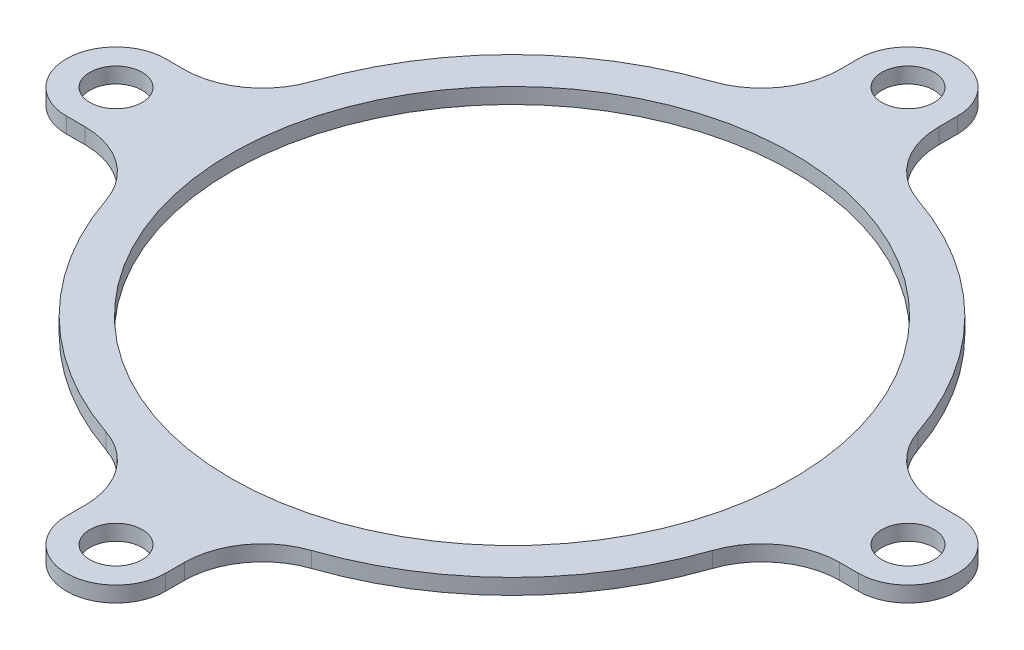
ISO-10303-21;
HEADER;
FILE_DESCRIPTION(('STEP AP214'),'2;1');
FILE_NAME('part.step','',(''),(''),'','','');
FILE_SCHEMA(('AUTOMOTIVE_DESIGN { 1 0 10303 214 1 1 1 1 }'));
ENDSEC;
DATA;
#1=APPLICATION_CONTEXT('core data for automotive mechanical design processes');
#2=APPLICATION_PROTOCOL_DEFINITION('international standard','automotive_design',2000,#1);
#3=PRODUCT_CONTEXT('',#1,'mechanical');
#4=PRODUCT('Part','Part','',(#3));
#5=PRODUCT_RELATED_PRODUCT_CATEGORY('part','',(#4));
#6=PRODUCT_DEFINITION_FORMATION('','',#4);
#7=PRODUCT_DEFINITION_CONTEXT('part definition',#1,'design');
#8=PRODUCT_DEFINITION('design','',#6,#7);
#9=PRODUCT_DEFINITION_SHAPE('','',#8);
#10=(LENGTH_UNIT() NAMED_UNIT(*) SI_UNIT(.MILLI.,.METRE.));
#11=(NAMED_UNIT(*) PLANE_ANGLE_UNIT() SI_UNIT($,.RADIAN.));
#12=(NAMED_UNIT(*) SI_UNIT($,.STERADIAN.) SOLID_ANGLE_UNIT());
#13=UNCERTAINTY_MEASURE_WITH_UNIT(LENGTH_MEASURE(1.E-05),#10,'distance_accuracy_value','');
#14=(GEOMETRIC_REPRESENTATION_CONTEXT(3) GLOBAL_UNCERTAINTY_ASSIGNED_CONTEXT((#13)) GLOBAL_UNIT_ASSIGNED_CONTEXT((#10,
#11,#12)) REPRESENTATION_CONTEXT('',''));
#15=CARTESIAN_POINT('',(0.,0.,0.));
#16=DIRECTION('',(0.,0.,1.));
#17=DIRECTION('',(1.,0.,0.));
#18=AXIS2_PLACEMENT_3D('',#15,#16,#17);
#19=CARTESIAN_POINT('',(0.,1.,0.));
#20=DIRECTION('',(0.,-1.,0.));
#21=DIRECTION('',(0.,0.,-1.));
#22=AXIS2_PLACEMENT_3D('',#19,#20,#21);
#23=CYLINDRICAL_SURFACE('',#22,41.);
#24=DIRECTION('',(0.,1.,0.));
#25=VECTOR('',#24,1.);
#26=CARTESIAN_POINT('',(38.8359649201647,-32.9815945313607,-13.1441176470592));
#27=LINE('',#26,#25);
#28=CARTESIAN_POINT('',(38.8359649201647,-1.,-13.1441176470592));
#29=VERTEX_POINT('',#28);
#30=CARTESIAN_POINT('',(38.8359649201647,1.,-13.1441176470592));
#31=VERTEX_POINT('',#30);
#32=EDGE_CURVE('E236',#29,#31,#27,.T.);
#33=ORIENTED_EDGE('',*,*,#32,.F.);
#34=CARTESIAN_POINT('',(0.,-1.,0.));
#35=DIRECTION('',(0.,1.,0.));
#36=DIRECTION('',(0.,0.,1.));
#37=AXIS2_PLACEMENT_3D('',#34,#35,#36);
#38=CIRCLE('',#37,41.);
#39=CARTESIAN_POINT('',(13.1441176470588,-1.,-38.8359649201649));
#40=VERTEX_POINT('',#39);
#41=EDGE_CURVE('E386',#29,#40,#38,.T.);
#42=ORIENTED_EDGE('',*,*,#41,.T.);
#43=DIRECTION('',(0.,1.,0.));
#44=VECTOR('',#43,1.);
#45=CARTESIAN_POINT('',(13.1441176470588,-32.9815945313606,-38.8359649201649));
#46=LINE('',#45,#44);
#47=CARTESIAN_POINT('',(13.1441176470588,1.,-38.8359649201649));
#48=VERTEX_POINT('',#47);
#49=EDGE_CURVE('E376',#40,#48,#46,.T.);
#50=ORIENTED_EDGE('',*,*,#49,.T.);
#51=CARTESIAN_POINT('',(0.,1.,0.));
#52=DIRECTION('',(0.,1.,0.));
#53=DIRECTION('',(0.,0.,1.));
#54=AXIS2_PLACEMENT_3D('',#51,#52,#53);
#55=CIRCLE('',#54,41.);
#56=EDGE_CURVE('E47',#31,#48,#55,.T.);
#57=ORIENTED_EDGE('',*,*,#56,.F.);
#58=EDGE_LOOP('',(#33,#42,#50,#57));
#59=FACE_BOUND('',#58,.T.);
#60=ADVANCED_FACE('F37',(#59),#23,.T.);
#61=CARTESIAN_POINT('',(13.1441176470588,-1.,38.8359649201649));
#62=VERTEX_POINT('',#61);
#63=CARTESIAN_POINT('',(38.835964920165,-1.,13.1441176470584));
#64=VERTEX_POINT('',#63);
#65=EDGE_CURVE('E444',#62,#64,#38,.T.);
#66=ORIENTED_EDGE('',*,*,#65,.T.);
#67=DIRECTION('',(0.,1.,0.));
#68=VECTOR('',#67,1.);
#69=CARTESIAN_POINT('',(38.835964920165,-32.9815945313607,13.1441176470584));
#70=LINE('',#69,#68);
#71=CARTESIAN_POINT('',(38.835964920165,1.,13.1441176470584));
#72=VERTEX_POINT('',#71);
#73=EDGE_CURVE('E61',#64,#72,#70,.T.);
#74=ORIENTED_EDGE('',*,*,#73,.T.);
#75=CARTESIAN_POINT('',(13.1441176470588,1.,38.8359649201649));
#76=VERTEX_POINT('',#75);
#77=EDGE_CURVE('E224',#76,#72,#55,.T.);
#78=ORIENTED_EDGE('',*,*,#77,.F.);
#79=DIRECTION('',(0.,1.,0.));
#80=VECTOR('',#79,1.);
#81=CARTESIAN_POINT('',(13.1441176470588,-32.9815945313606,38.8359649201649));
#82=LINE('',#81,#80);
#83=EDGE_CURVE('E278',#62,#76,#82,.T.);
#84=ORIENTED_EDGE('',*,*,#83,.F.);
#85=EDGE_LOOP('',(#66,#74,#78,#84));
#86=FACE_BOUND('',#85,.T.);
#87=ADVANCED_FACE('F410',(#86),#23,.T.);
#88=CARTESIAN_POINT('',(-38.8359649201648,-1.,13.1441176470589));
#89=VERTEX_POINT('',#88);
#90=CARTESIAN_POINT('',(-13.1441176470588,-1.,38.8359649201649));
#91=VERTEX_POINT('',#90);
#92=EDGE_CURVE('E440',#89,#91,#38,.T.);
#93=ORIENTED_EDGE('',*,*,#92,.T.);
#94=DIRECTION('',(0.,1.,0.));
#95=VECTOR('',#94,1.);
#96=CARTESIAN_POINT('',(-13.1441176470588,-32.9815945313606,38.8359649201649));
#97=LINE('',#96,#95);
#98=CARTESIAN_POINT('',(-13.1441176470588,1.,38.8359649201649));
#99=VERTEX_POINT('',#98);
#100=EDGE_CURVE('E286',#91,#99,#97,.T.);
#101=ORIENTED_EDGE('',*,*,#100,.T.);
#102=CARTESIAN_POINT('',(-38.8359649201648,1.,13.144117647059));
#103=VERTEX_POINT('',#102);
#104=EDGE_CURVE('E46',#103,#99,#55,.T.);
#105=ORIENTED_EDGE('',*,*,#104,.F.);
#106=DIRECTION('',(0.,1.,0.));
#107=VECTOR('',#106,1.);
#108=CARTESIAN_POINT('',(-38.8359649201648,-32.9815945313607,13.1441176470589));
#109=LINE('',#108,#107);
#110=EDGE_CURVE('E323',#89,#103,#109,.T.);
#111=ORIENTED_EDGE('',*,*,#110,.F.);
#112=EDGE_LOOP('',(#93,#101,#105,#111));
#113=FACE_BOUND('',#112,.T.);
#114=ADVANCED_FACE('F406',(#113),#23,.T.);
#115=CARTESIAN_POINT('',(0.,1.,0.));
#116=DIRECTION('',(0.,1.,0.));
#117=DIRECTION('',(0.,0.,1.));
#118=AXIS2_PLACEMENT_3D('',#115,#116,#117);
#119=PLANE('',#118);
#120=CARTESIAN_POINT('',(-13.1441176470588,1.,-38.8359649201649));
#121=VERTEX_POINT('',#120);
#122=CARTESIAN_POINT('',(-38.8359649201649,1.,-13.1441176470587));
#123=VERTEX_POINT('',#122);
#124=EDGE_CURVE('E11',#121,#123,#55,.T.);
#125=ORIENTED_EDGE('',*,*,#124,.T.);
#126=CARTESIAN_POINT('',(-48.3081514860588,1.,-16.3499999999998));
#127=DIRECTION('',(0.,-1.,0.));
#128=DIRECTION('',(1.,0.,0.));
#129=AXIS2_PLACEMENT_3D('',#126,#127,#128);
#130=CIRCLE('',#129,10.);
#131=CARTESIAN_POINT('',(-48.3081514860588,1.,-6.34999999999983));
#132=VERTEX_POINT('',#131);
#133=EDGE_CURVE('E311',#123,#132,#130,.T.);
#134=ORIENTED_EDGE('',*,*,#133,.T.);
#135=DIRECTION('',(-1.,0.,0.));
#136=VECTOR('',#135,1.);
#137=CARTESIAN_POINT('',(-50.7,1.,-6.34999999999982));
#138=LINE('',#137,#136);
#139=CARTESIAN_POINT('',(-50.7,1.,-6.34999999999982));
#140=VERTEX_POINT('',#139);
#141=EDGE_CURVE('E314',#132,#140,#138,.T.);
#142=ORIENTED_EDGE('',*,*,#141,.T.);
#143=CARTESIAN_POINT('',(-50.7,1.,1.77018103879347E-13));
#144=DIRECTION('',(0.,1.,0.));
#145=DIRECTION('',(-1.,0.,0.));
#146=AXIS2_PLACEMENT_3D('',#143,#144,#145);
#147=CIRCLE('',#146,6.35);
#148=CARTESIAN_POINT('',(-50.7,1.,6.35000000000018));
#149=VERTEX_POINT('',#148);
#150=EDGE_CURVE('E317',#140,#149,#147,.T.);
#151=ORIENTED_EDGE('',*,*,#150,.T.);
#152=DIRECTION('',(1.,0.,0.));
#153=VECTOR('',#152,1.);
#154=CARTESIAN_POINT('',(-48.3081514860587,1.,6.35000000000017));
#155=LINE('',#154,#153);
#156=CARTESIAN_POINT('',(-48.3081514860587,1.,6.35000000000017));
#157=VERTEX_POINT('',#156);
#158=EDGE_CURVE('E320',#149,#157,#155,.T.);
#159=ORIENTED_EDGE('',*,*,#158,.T.);
#160=CARTESIAN_POINT('',(-48.3081514860587,1.,16.3500000000002));
#161=DIRECTION('',(0.,-1.,0.));
#162=DIRECTION('',(-1.,0.,0.));
#163=AXIS2_PLACEMENT_3D('',#160,#161,#162);
#164=CIRCLE('',#163,10.);
#165=EDGE_CURVE('E308',#157,#103,#164,.T.);
#166=ORIENTED_EDGE('',*,*,#165,.T.);
#167=ORIENTED_EDGE('',*,*,#104,.T.);
#168=CARTESIAN_POINT('',(-16.35,1.,48.3081514860587));
#169=DIRECTION('',(0.,-1.,0.));
#170=DIRECTION('',(0.,0.,-1.));
#171=AXIS2_PLACEMENT_3D('',#168,#169,#170);
#172=CIRCLE('',#171,10.);
#173=CARTESIAN_POINT('',(-6.35,1.,48.3081514860587));
#174=VERTEX_POINT('',#173);
#175=EDGE_CURVE('E266',#99,#174,#172,.T.);
#176=ORIENTED_EDGE('',*,*,#175,.T.);
#177=DIRECTION('',(0.,0.,1.));
#178=VECTOR('',#177,1.);
#179=CARTESIAN_POINT('',(-6.35,1.,50.7));
#180=LINE('',#179,#178);
#181=CARTESIAN_POINT('',(-6.35,1.,50.7));
#182=VERTEX_POINT('',#181);
#183=EDGE_CURVE('E269',#174,#182,#180,.T.);
#184=ORIENTED_EDGE('',*,*,#183,.T.);
#185=CARTESIAN_POINT('',(0.,1.,50.7));
#186=DIRECTION('',(0.,1.,0.));
#187=DIRECTION('',(0.,0.,1.));
#188=AXIS2_PLACEMENT_3D('',#185,#186,#187);
#189=CIRCLE('',#188,6.35);
#190=CARTESIAN_POINT('',(6.35,1.,50.7));
#191=VERTEX_POINT('',#190);
#192=EDGE_CURVE('E272',#182,#191,#189,.T.);
#193=ORIENTED_EDGE('',*,*,#192,.T.);
#194=DIRECTION('',(0.,0.,-1.));
#195=VECTOR('',#194,1.);
#196=CARTESIAN_POINT('',(6.35,1.,48.3081514860587));
#197=LINE('',#196,#195);
#198=CARTESIAN_POINT('',(6.35,1.,48.3081514860587));
#199=VERTEX_POINT('',#198);
#200=EDGE_CURVE('E275',#191,#199,#197,.T.);
#201=ORIENTED_EDGE('',*,*,#200,.T.);
#202=CARTESIAN_POINT('',(16.35,1.,48.3081514860587));
#203=DIRECTION('',(0.,-1.,0.));
#204=DIRECTION('',(0.,0.,1.));
#205=AXIS2_PLACEMENT_3D('',#202,#203,#204);
#206=CIRCLE('',#205,10.);
#207=EDGE_CURVE('E264',#199,#76,#206,.T.);
#208=ORIENTED_EDGE('',*,*,#207,.T.);
#209=ORIENTED_EDGE('',*,*,#77,.T.);
#210=CARTESIAN_POINT('',(48.3081514860589,1.,16.3499999999995));
#211=DIRECTION('',(0.,-1.,0.));
#212=DIRECTION('',(-1.,0.,0.));
#213=AXIS2_PLACEMENT_3D('',#210,#211,#212);
#214=CIRCLE('',#213,10.);
#215=CARTESIAN_POINT('',(48.3081514860588,1.,6.34999999999949));
#216=VERTEX_POINT('',#215);
#217=EDGE_CURVE('E205',#72,#216,#214,.T.);
#218=ORIENTED_EDGE('',*,*,#217,.T.);
#219=DIRECTION('',(1.,0.,0.));
#220=VECTOR('',#219,1.);
#221=CARTESIAN_POINT('',(50.7000000000001,1.,6.34999999999947));
#222=LINE('',#221,#220);
#223=CARTESIAN_POINT('',(50.7000000000001,1.,6.34999999999947));
#224=VERTEX_POINT('',#223);
#225=EDGE_CURVE('E213',#216,#224,#222,.T.);
#226=ORIENTED_EDGE('',*,*,#225,.T.);
#227=CARTESIAN_POINT('',(50.7,1.,-5.31054311638041E-13));
#228=DIRECTION('',(0.,1.,0.));
#229=DIRECTION('',(1.,0.,0.));
#230=AXIS2_PLACEMENT_3D('',#227,#228,#229);
#231=CIRCLE('',#230,6.35);
#232=CARTESIAN_POINT('',(50.6999999999999,1.,-6.35000000000053));
#233=VERTEX_POINT('',#232);
#234=EDGE_CURVE('E219',#224,#233,#231,.T.);
#235=ORIENTED_EDGE('',*,*,#234,.T.);
#236=DIRECTION('',(-1.,0.,0.));
#237=VECTOR('',#236,1.);
#238=CARTESIAN_POINT('',(48.3081514860587,1.,-6.35000000000051));
#239=LINE('',#238,#237);
#240=CARTESIAN_POINT('',(48.3081514860587,1.,-6.35000000000051));
#241=VERTEX_POINT('',#240);
#242=EDGE_CURVE('E233',#233,#241,#239,.T.);
#243=ORIENTED_EDGE('',*,*,#242,.T.);
#244=CARTESIAN_POINT('',(48.3081514860586,1.,-16.3500000000005));
#245=DIRECTION('',(0.,-1.,0.));
#246=DIRECTION('',(1.,0.,0.));
#247=AXIS2_PLACEMENT_3D('',#244,#245,#246);
#248=CIRCLE('',#247,10.);
#249=EDGE_CURVE('E225',#241,#31,#248,.T.);
#250=ORIENTED_EDGE('',*,*,#249,.T.);
#251=ORIENTED_EDGE('',*,*,#56,.T.);
#252=CARTESIAN_POINT('',(16.35,1.,-48.3081514860587));
#253=DIRECTION('',(0.,-1.,0.));
#254=DIRECTION('',(0.,0.,1.));
#255=AXIS2_PLACEMENT_3D('',#252,#253,#254);
#256=CIRCLE('',#255,10.);
#257=CARTESIAN_POINT('',(6.35,1.,-48.3081514860587));
#258=VERTEX_POINT('',#257);
#259=EDGE_CURVE('E356',#48,#258,#256,.T.);
#260=ORIENTED_EDGE('',*,*,#259,.T.);
#261=DIRECTION('',(0.,0.,-1.));
#262=VECTOR('',#261,1.);
#263=CARTESIAN_POINT('',(6.35,1.,-50.7));
#264=LINE('',#263,#262);
#265=CARTESIAN_POINT('',(6.35,1.,-50.7));
#266=VERTEX_POINT('',#265);
#267=EDGE_CURVE('E359',#258,#266,#264,.T.);
#268=ORIENTED_EDGE('',*,*,#267,.T.);
#269=CARTESIAN_POINT('',(0.,1.,-50.7));
#270=DIRECTION('',(0.,1.,0.));
#271=DIRECTION('',(0.,0.,-1.));
#272=AXIS2_PLACEMENT_3D('',#269,#270,#271);
#273=CIRCLE('',#272,6.35);
#274=CARTESIAN_POINT('',(-6.35,1.,-50.7));
#275=VERTEX_POINT('',#274);
#276=EDGE_CURVE('E362',#266,#275,#273,.T.);
#277=ORIENTED_EDGE('',*,*,#276,.T.);
#278=DIRECTION('',(0.,0.,1.));
#279=VECTOR('',#278,1.);
#280=CARTESIAN_POINT('',(-6.35,1.,-48.3081514860587));
#281=LINE('',#280,#279);
#282=CARTESIAN_POINT('',(-6.35,1.,-48.3081514860587));
#283=VERTEX_POINT('',#282);
#284=EDGE_CURVE('E365',#275,#283,#281,.T.);
#285=ORIENTED_EDGE('',*,*,#284,.T.);
#286=CARTESIAN_POINT('',(-16.35,1.,-48.3081514860587));
#287=DIRECTION('',(0.,-1.,0.));
#288=DIRECTION('',(0.,0.,-1.));
#289=AXIS2_PLACEMENT_3D('',#286,#287,#288);
#290=CIRCLE('',#289,10.);
#291=EDGE_CURVE('E353',#283,#121,#290,.T.);
#292=ORIENTED_EDGE('',*,*,#291,.T.);
#293=EDGE_LOOP('',(#125,#134,#142,#151,#159,#166,#167,#176,#184,#193,#201,#208,#209,#218,#226,
#235,#243,#250,#251,#260,#268,#277,#285,#292));
#294=FACE_BOUND('',#293,.T.);
#295=CARTESIAN_POINT('',(0.,1.,0.));
#296=DIRECTION('',(0.,1.,0.));
#297=DIRECTION('',(0.,0.,1.));
#298=AXIS2_PLACEMENT_3D('',#295,#296,#297);
#299=CIRCLE('',#298,36.);
#300=CARTESIAN_POINT('',(0.,1.,36.));
#301=VERTEX_POINT('',#300);
#302=EDGE_CURVE('E383',#301,#301,#299,.T.);
#303=ORIENTED_EDGE('',*,*,#302,.F.);
#304=EDGE_LOOP('',(#303));
#305=FACE_BOUND('',#304,.T.);
#306=CARTESIAN_POINT('',(0.,1.,-50.7));
#307=DIRECTION('',(0.,1.,0.));
#308=DIRECTION('',(0.,0.,1.));
#309=AXIS2_PLACEMENT_3D('',#306,#307,#308);
#310=CIRCLE('',#309,3.35);
#311=CARTESIAN_POINT('',(0.,1.,-47.35));
#312=VERTEX_POINT('',#311);
#313=EDGE_CURVE('E337',#312,#312,#310,.T.);
#314=ORIENTED_EDGE('',*,*,#313,.F.);
#315=EDGE_LOOP('',(#314));
#316=FACE_BOUND('',#315,.T.);
#317=CARTESIAN_POINT('',(-50.7,1.,1.77018103879347E-13));
#318=DIRECTION('',(0.,1.,0.));
#319=DIRECTION('',(1.,0.,0.));
#320=AXIS2_PLACEMENT_3D('',#317,#318,#319);
#321=CIRCLE('',#320,3.35);
#322=CARTESIAN_POINT('',(-47.35,1.,1.65321641394222E-13));
#323=VERTEX_POINT('',#322);
#324=EDGE_CURVE('E292',#323,#323,#321,.T.);
#325=ORIENTED_EDGE('',*,*,#324,.F.);
#326=EDGE_LOOP('',(#325));
#327=FACE_BOUND('',#326,.T.);
#328=CARTESIAN_POINT('',(0.,1.,50.7));
#329=DIRECTION('',(0.,1.,0.));
#330=DIRECTION('',(0.,0.,-1.));
#331=AXIS2_PLACEMENT_3D('',#328,#329,#330);
#332=CIRCLE('',#331,3.35);
#333=CARTESIAN_POINT('',(0.,1.,47.35));
#334=VERTEX_POINT('',#333);
#335=EDGE_CURVE('E247',#334,#334,#332,.T.);
#336=ORIENTED_EDGE('',*,*,#335,.F.);
#337=EDGE_LOOP('',(#336));
#338=FACE_BOUND('',#337,.T.);
#339=CARTESIAN_POINT('',(50.7,1.,-5.31054311638041E-13));
#340=DIRECTION('',(0.,1.,0.));
#341=DIRECTION('',(-1.,0.,0.));
#342=AXIS2_PLACEMENT_3D('',#339,#340,#341);
#343=CIRCLE('',#342,3.35);
#344=CARTESIAN_POINT('',(47.35,1.,-4.95964924182667E-13));
#345=VERTEX_POINT('',#344);
#346=EDGE_CURVE('E228',#345,#345,#343,.T.);
#347=ORIENTED_EDGE('',*,*,#346,.F.);
#348=EDGE_LOOP('',(#347));
#349=FACE_BOUND('',#348,.T.);
#350=ADVANCED_FACE('F221',(#294,#305,#316,#327,#338,#349),#119,.T.);
#351=CARTESIAN_POINT('',(0.,-1.,0.));
#352=DIRECTION('',(0.,1.,0.));
#353=DIRECTION('',(0.,0.,1.));
#354=AXIS2_PLACEMENT_3D('',#351,#352,#353);
#355=PLANE('',#354);
#356=CARTESIAN_POINT('',(-13.1441176470588,-1.,-38.8359649201649));
#357=VERTEX_POINT('',#356);
#358=CARTESIAN_POINT('',(-38.8359649201649,-1.,-13.1441176470587));
#359=VERTEX_POINT('',#358);
#360=EDGE_CURVE('E41',#357,#359,#38,.T.);
#361=ORIENTED_EDGE('',*,*,#360,.F.);
#362=CARTESIAN_POINT('',(-16.35,-1.,-48.3081514860587));
#363=DIRECTION('',(0.,1.,0.));
#364=DIRECTION('',(0.,0.,1.));
#365=AXIS2_PLACEMENT_3D('',#362,#363,#364);
#366=CIRCLE('',#365,10.);
#367=CARTESIAN_POINT('',(-6.35,-1.,-48.3081514860587));
#368=VERTEX_POINT('',#367);
#369=EDGE_CURVE('E348',#357,#368,#366,.T.);
#370=ORIENTED_EDGE('',*,*,#369,.T.);
#371=DIRECTION('',(0.,0.,-1.));
#372=VECTOR('',#371,1.);
#373=CARTESIAN_POINT('',(-6.35,-1.,-48.3081514860587));
#374=LINE('',#373,#372);
#375=CARTESIAN_POINT('',(-6.35,-1.,-50.7));
#376=VERTEX_POINT('',#375);
#377=EDGE_CURVE('E346',#368,#376,#374,.T.);
#378=ORIENTED_EDGE('',*,*,#377,.T.);
#379=CARTESIAN_POINT('',(0.,-1.,-50.7));
#380=DIRECTION('',(0.,1.,0.));
#381=DIRECTION('',(0.,0.,1.));
#382=AXIS2_PLACEMENT_3D('',#379,#380,#381);
#383=CIRCLE('',#382,6.35);
#384=CARTESIAN_POINT('',(6.35,-1.,-50.7));
#385=VERTEX_POINT('',#384);
#386=EDGE_CURVE('E344',#376,#385,#383,.F.);
#387=ORIENTED_EDGE('',*,*,#386,.T.);
#388=DIRECTION('',(0.,0.,1.));
#389=VECTOR('',#388,1.);
#390=CARTESIAN_POINT('',(6.35,-1.,-50.7));
#391=LINE('',#390,#389);
#392=CARTESIAN_POINT('',(6.35,-1.,-48.3081514860587));
#393=VERTEX_POINT('',#392);
#394=EDGE_CURVE('E341',#385,#393,#391,.T.);
#395=ORIENTED_EDGE('',*,*,#394,.T.);
#396=CARTESIAN_POINT('',(16.35,-1.,-48.3081514860587));
#397=DIRECTION('',(0.,1.,0.));
#398=DIRECTION('',(0.,0.,1.));
#399=AXIS2_PLACEMENT_3D('',#396,#397,#398);
#400=CIRCLE('',#399,10.);
#401=EDGE_CURVE('E338',#393,#40,#400,.T.);
#402=ORIENTED_EDGE('',*,*,#401,.T.);
#403=ORIENTED_EDGE('',*,*,#41,.F.);
#404=CARTESIAN_POINT('',(48.3081514860586,-1.,-16.3500000000005));
#405=DIRECTION('',(0.,1.,0.));
#406=DIRECTION('',(0.,0.,1.));
#407=AXIS2_PLACEMENT_3D('',#404,#405,#406);
#408=CIRCLE('',#407,10.);
#409=CARTESIAN_POINT('',(48.3081514860587,-1.,-6.35000000000051));
#410=VERTEX_POINT('',#409);
#411=EDGE_CURVE('E248',#29,#410,#408,.T.);
#412=ORIENTED_EDGE('',*,*,#411,.T.);
#413=DIRECTION('',(1.,0.,0.));
#414=VECTOR('',#413,1.);
#415=CARTESIAN_POINT('',(48.3081514860587,-1.,-6.35000000000051));
#416=LINE('',#415,#414);
#417=CARTESIAN_POINT('',(50.6999999999999,-1.,-6.35000000000053));
#418=VERTEX_POINT('',#417);
#419=EDGE_CURVE('E421',#410,#418,#416,.T.);
#420=ORIENTED_EDGE('',*,*,#419,.T.);
#421=CARTESIAN_POINT('',(50.7,-1.,-5.31054311638041E-13));
#422=DIRECTION('',(0.,1.,0.));
#423=DIRECTION('',(0.,0.,1.));
#424=AXIS2_PLACEMENT_3D('',#421,#422,#423);
#425=CIRCLE('',#424,6.35);
#426=CARTESIAN_POINT('',(50.7000000000001,-1.,6.34999999999947));
#427=VERTEX_POINT('',#426);
#428=EDGE_CURVE('E423',#418,#427,#425,.F.);
#429=ORIENTED_EDGE('',*,*,#428,.T.);
#430=DIRECTION('',(-1.,0.,0.));
#431=VECTOR('',#430,1.);
#432=CARTESIAN_POINT('',(50.7000000000001,-1.,6.34999999999947));
#433=LINE('',#432,#431);
#434=CARTESIAN_POINT('',(48.3081514860588,-1.,6.3499999999995));
#435=VERTEX_POINT('',#434);
#436=EDGE_CURVE('E456',#427,#435,#433,.T.);
#437=ORIENTED_EDGE('',*,*,#436,.T.);
#438=CARTESIAN_POINT('',(48.3081514860589,-1.,16.3499999999995));
#439=DIRECTION('',(0.,1.,0.));
#440=DIRECTION('',(0.,0.,1.));
#441=AXIS2_PLACEMENT_3D('',#438,#439,#440);
#442=CIRCLE('',#441,10.);
#443=EDGE_CURVE('E207',#435,#64,#442,.T.);
#444=ORIENTED_EDGE('',*,*,#443,.T.);
#445=ORIENTED_EDGE('',*,*,#65,.F.);
#446=CARTESIAN_POINT('',(16.35,-1.,48.3081514860587));
#447=DIRECTION('',(0.,1.,0.));
#448=DIRECTION('',(0.,0.,1.));
#449=AXIS2_PLACEMENT_3D('',#446,#447,#448);
#450=CIRCLE('',#449,10.);
#451=CARTESIAN_POINT('',(6.35,-1.,48.3081514860587));
#452=VERTEX_POINT('',#451);
#453=EDGE_CURVE('E259',#62,#452,#450,.T.);
#454=ORIENTED_EDGE('',*,*,#453,.T.);
#455=DIRECTION('',(0.,0.,1.));
#456=VECTOR('',#455,1.);
#457=CARTESIAN_POINT('',(6.35,-1.,48.3081514860587));
#458=LINE('',#457,#456);
#459=CARTESIAN_POINT('',(6.35,-1.,50.7));
#460=VERTEX_POINT('',#459);
#461=EDGE_CURVE('E257',#452,#460,#458,.T.);
#462=ORIENTED_EDGE('',*,*,#461,.T.);
#463=CARTESIAN_POINT('',(0.,-1.,50.7));
#464=DIRECTION('',(0.,1.,0.));
#465=DIRECTION('',(0.,0.,1.));
#466=AXIS2_PLACEMENT_3D('',#463,#464,#465);
#467=CIRCLE('',#466,6.35);
#468=CARTESIAN_POINT('',(-6.35,-1.,50.7));
#469=VERTEX_POINT('',#468);
#470=EDGE_CURVE('E255',#460,#469,#467,.F.);
#471=ORIENTED_EDGE('',*,*,#470,.T.);
#472=DIRECTION('',(0.,0.,-1.));
#473=VECTOR('',#472,1.);
#474=CARTESIAN_POINT('',(-6.35,-1.,50.7));
#475=LINE('',#474,#473);
#476=CARTESIAN_POINT('',(-6.35,-1.,48.3081514860587));
#477=VERTEX_POINT('',#476);
#478=EDGE_CURVE('E252',#469,#477,#475,.T.);
#479=ORIENTED_EDGE('',*,*,#478,.T.);
#480=CARTESIAN_POINT('',(-16.35,-1.,48.3081514860587));
#481=DIRECTION('',(0.,1.,0.));
#482=DIRECTION('',(0.,0.,1.));
#483=AXIS2_PLACEMENT_3D('',#480,#481,#482);
#484=CIRCLE('',#483,10.);
#485=EDGE_CURVE('E249',#477,#91,#484,.T.);
#486=ORIENTED_EDGE('',*,*,#485,.T.);
#487=ORIENTED_EDGE('',*,*,#92,.F.);
#488=CARTESIAN_POINT('',(-48.3081514860587,-1.,16.3500000000002));
#489=DIRECTION('',(0.,1.,0.));
#490=DIRECTION('',(0.,0.,1.));
#491=AXIS2_PLACEMENT_3D('',#488,#489,#490);
#492=CIRCLE('',#491,10.);
#493=CARTESIAN_POINT('',(-48.3081514860587,-1.,6.35000000000017));
#494=VERTEX_POINT('',#493);
#495=EDGE_CURVE('E303',#89,#494,#492,.T.);
#496=ORIENTED_EDGE('',*,*,#495,.T.);
#497=DIRECTION('',(-1.,0.,0.));
#498=VECTOR('',#497,1.);
#499=CARTESIAN_POINT('',(-48.3081514860587,-1.,6.35000000000017));
#500=LINE('',#499,#498);
#501=CARTESIAN_POINT('',(-50.7,-1.,6.35000000000018));
#502=VERTEX_POINT('',#501);
#503=EDGE_CURVE('E301',#494,#502,#500,.T.);
#504=ORIENTED_EDGE('',*,*,#503,.T.);
#505=CARTESIAN_POINT('',(-50.7,-1.,1.77018103879347E-13));
#506=DIRECTION('',(0.,1.,0.));
#507=DIRECTION('',(0.,0.,1.));
#508=AXIS2_PLACEMENT_3D('',#505,#506,#507);
#509=CIRCLE('',#508,6.35);
#510=CARTESIAN_POINT('',(-50.7,-1.,-6.34999999999982));
#511=VERTEX_POINT('',#510);
#512=EDGE_CURVE('E299',#502,#511,#509,.F.);
#513=ORIENTED_EDGE('',*,*,#512,.T.);
#514=DIRECTION('',(1.,0.,0.));
#515=VECTOR('',#514,1.);
#516=CARTESIAN_POINT('',(-50.7,-1.,-6.34999999999982));
#517=LINE('',#516,#515);
#518=CARTESIAN_POINT('',(-48.3081514860588,-1.,-6.34999999999983));
#519=VERTEX_POINT('',#518);
#520=EDGE_CURVE('E296',#511,#519,#517,.T.);
#521=ORIENTED_EDGE('',*,*,#520,.T.);
#522=CARTESIAN_POINT('',(-48.3081514860588,-1.,-16.3499999999998));
#523=DIRECTION('',(0.,1.,0.));
#524=DIRECTION('',(0.,0.,1.));
#525=AXIS2_PLACEMENT_3D('',#522,#523,#524);
#526=CIRCLE('',#525,10.);
#527=EDGE_CURVE('E293',#519,#359,#526,.T.);
#528=ORIENTED_EDGE('',*,*,#527,.T.);
#529=EDGE_LOOP('',(#361,#370,#378,#387,#395,#402,#403,#412,#420,#429,#437,#444,#445,#454,#462,
#471,#479,#486,#487,#496,#504,#513,#521,#528));
#530=FACE_BOUND('',#529,.T.);
#531=CARTESIAN_POINT('',(0.,-1.,0.));
#532=DIRECTION('',(0.,1.,0.));
#533=DIRECTION('',(0.,0.,1.));
#534=AXIS2_PLACEMENT_3D('',#531,#532,#533);
#535=CIRCLE('',#534,36.);
#536=CARTESIAN_POINT('',(0.,-1.,36.));
#537=VERTEX_POINT('',#536);
#538=EDGE_CURVE('E382',#537,#537,#535,.T.);
#539=ORIENTED_EDGE('',*,*,#538,.T.);
#540=EDGE_LOOP('',(#539));
#541=FACE_BOUND('',#540,.T.);
#542=CARTESIAN_POINT('',(0.,-1.,-50.7));
#543=DIRECTION('',(0.,1.,0.));
#544=DIRECTION('',(0.,0.,1.));
#545=AXIS2_PLACEMENT_3D('',#542,#543,#544);
#546=CIRCLE('',#545,3.35);
#547=CARTESIAN_POINT('',(0.,-1.,-47.35));
#548=VERTEX_POINT('',#547);
#549=EDGE_CURVE('E350',#548,#548,#546,.F.);
#550=ORIENTED_EDGE('',*,*,#549,.F.);
#551=EDGE_LOOP('',(#550));
#552=FACE_BOUND('',#551,.T.);
#553=CARTESIAN_POINT('',(-50.7,-1.,1.77018103879347E-13));
#554=DIRECTION('',(0.,1.,0.));
#555=DIRECTION('',(0.,0.,1.));
#556=AXIS2_PLACEMENT_3D('',#553,#554,#555);
#557=CIRCLE('',#556,3.35);
#558=CARTESIAN_POINT('',(-50.7,-1.,3.35000000000018));
#559=VERTEX_POINT('',#558);
#560=EDGE_CURVE('E305',#559,#559,#557,.F.);
#561=ORIENTED_EDGE('',*,*,#560,.F.);
#562=EDGE_LOOP('',(#561));
#563=FACE_BOUND('',#562,.T.);
#564=CARTESIAN_POINT('',(0.,-1.,50.7));
#565=DIRECTION('',(0.,1.,0.));
#566=DIRECTION('',(0.,0.,1.));
#567=AXIS2_PLACEMENT_3D('',#564,#565,#566);
#568=CIRCLE('',#567,3.35);
#569=CARTESIAN_POINT('',(0.,-1.,54.05));
#570=VERTEX_POINT('',#569);
#571=EDGE_CURVE('E261',#570,#570,#568,.F.);
#572=ORIENTED_EDGE('',*,*,#571,.F.);
#573=EDGE_LOOP('',(#572));
#574=FACE_BOUND('',#573,.T.);
#575=CARTESIAN_POINT('',(50.7,-1.,-5.31054311638041E-13));
#576=DIRECTION('',(0.,1.,0.));
#577=DIRECTION('',(0.,0.,1.));
#578=AXIS2_PLACEMENT_3D('',#575,#576,#577);
#579=CIRCLE('',#578,3.35);
#580=CARTESIAN_POINT('',(50.7,-1.,3.34999999999947));
#581=VERTEX_POINT('',#580);
#582=EDGE_CURVE('E244',#581,#581,#579,.F.);
#583=ORIENTED_EDGE('',*,*,#582,.F.);
#584=EDGE_LOOP('',(#583));
#585=FACE_BOUND('',#584,.T.);
#586=ADVANCED_FACE('F390',(#530,#541,#552,#563,#574,#585),#355,.F.);
#587=ORIENTED_EDGE('',*,*,#360,.T.);
#588=DIRECTION('',(0.,1.,0.));
#589=VECTOR('',#588,1.);
#590=CARTESIAN_POINT('',(-38.8359649201649,-32.9815945313607,-13.1441176470587));
#591=LINE('',#590,#589);
#592=EDGE_CURVE('E331',#359,#123,#591,.T.);
#593=ORIENTED_EDGE('',*,*,#592,.T.);
#594=ORIENTED_EDGE('',*,*,#124,.F.);
#595=DIRECTION('',(0.,1.,0.));
#596=VECTOR('',#595,1.);
#597=CARTESIAN_POINT('',(-13.1441176470588,-32.9815945313606,-38.8359649201649));
#598=LINE('',#597,#596);
#599=EDGE_CURVE('E368',#357,#121,#598,.T.);
#600=ORIENTED_EDGE('',*,*,#599,.F.);
#601=EDGE_LOOP('',(#587,#593,#594,#600));
#602=FACE_BOUND('',#601,.T.);
#603=ADVANCED_FACE('F39',(#602),#23,.T.);
#604=CARTESIAN_POINT('',(0.,1.,0.));
#605=DIRECTION('',(0.,-1.,0.));
#606=DIRECTION('',(0.,0.,-1.));
#607=AXIS2_PLACEMENT_3D('',#604,#605,#606);
#608=CYLINDRICAL_SURFACE('',#607,36.);
#609=ORIENTED_EDGE('',*,*,#302,.T.);
#610=EDGE_LOOP('',(#609));
#611=FACE_BOUND('',#610,.T.);
#612=ORIENTED_EDGE('',*,*,#538,.F.);
#613=EDGE_LOOP('',(#612));
#614=FACE_BOUND('',#613,.T.);
#615=ADVANCED_FACE('F393',(#611,#614),#608,.F.);
#616=CARTESIAN_POINT('',(16.35,-32.9815945313606,-48.3081514860587));
#617=DIRECTION('',(0.,1.,0.));
#618=DIRECTION('',(0.,0.,1.));
#619=AXIS2_PLACEMENT_3D('',#616,#617,#618);
#620=CYLINDRICAL_SURFACE('',#619,10.);
#621=ORIENTED_EDGE('',*,*,#401,.F.);
#622=DIRECTION('',(0.,1.,0.));
#623=VECTOR('',#622,1.);
#624=CARTESIAN_POINT('',(6.35,-32.9815945313606,-48.3081514860587));
#625=LINE('',#624,#623);
#626=EDGE_CURVE('E374',#393,#258,#625,.T.);
#627=ORIENTED_EDGE('',*,*,#626,.T.);
#628=ORIENTED_EDGE('',*,*,#259,.F.);
#629=ORIENTED_EDGE('',*,*,#49,.F.);
#630=EDGE_LOOP('',(#621,#627,#628,#629));
#631=FACE_BOUND('',#630,.T.);
#632=ADVANCED_FACE('F395',(#631),#620,.F.);
#633=CARTESIAN_POINT('',(6.35,-32.9815945313606,-50.7));
#634=DIRECTION('',(1.,0.,0.));
#635=DIRECTION('',(0.,0.,-1.));
#636=AXIS2_PLACEMENT_3D('',#633,#634,#635);
#637=PLANE('',#636);
#638=ORIENTED_EDGE('',*,*,#394,.F.);
#639=DIRECTION('',(0.,1.,0.));
#640=VECTOR('',#639,1.);
#641=CARTESIAN_POINT('',(6.35,-32.9815945313606,-50.7));
#642=LINE('',#641,#640);
#643=EDGE_CURVE('E372',#385,#266,#642,.T.);
#644=ORIENTED_EDGE('',*,*,#643,.T.);
#645=ORIENTED_EDGE('',*,*,#267,.F.);
#646=ORIENTED_EDGE('',*,*,#626,.F.);
#647=EDGE_LOOP('',(#638,#644,#645,#646));
#648=FACE_BOUND('',#647,.T.);
#649=ADVANCED_FACE('F402',(#648),#637,.T.);
#650=CARTESIAN_POINT('',(0.,-32.9815945313606,-50.7));
#651=DIRECTION('',(0.,1.,0.));
#652=DIRECTION('',(0.,0.,1.));
#653=AXIS2_PLACEMENT_3D('',#650,#651,#652);
#654=CYLINDRICAL_SURFACE('',#653,6.35);
#655=ORIENTED_EDGE('',*,*,#386,.F.);
#656=DIRECTION('',(0.,1.,0.));
#657=VECTOR('',#656,1.);
#658=CARTESIAN_POINT('',(-6.35,-32.9815945313606,-50.7));
#659=LINE('',#658,#657);
#660=EDGE_CURVE('E370',#376,#275,#659,.T.);
#661=ORIENTED_EDGE('',*,*,#660,.T.);
#662=ORIENTED_EDGE('',*,*,#276,.F.);
#663=ORIENTED_EDGE('',*,*,#643,.F.);
#664=EDGE_LOOP('',(#655,#661,#662,#663));
#665=FACE_BOUND('',#664,.T.);
#666=ADVANCED_FACE('F534',(#665),#654,.T.);
#667=CARTESIAN_POINT('',(-6.35,-32.9815945313606,-48.3081514860587));
#668=DIRECTION('',(-1.,0.,0.));
#669=DIRECTION('',(0.,0.,1.));
#670=AXIS2_PLACEMENT_3D('',#667,#668,#669);
#671=PLANE('',#670);
#672=ORIENTED_EDGE('',*,*,#377,.F.);
#673=DIRECTION('',(0.,1.,0.));
#674=VECTOR('',#673,1.);
#675=CARTESIAN_POINT('',(-6.35,-32.9815945313606,-48.3081514860587));
#676=LINE('',#675,#674);
#677=EDGE_CURVE('E342',#368,#283,#676,.T.);
#678=ORIENTED_EDGE('',*,*,#677,.T.);
#679=ORIENTED_EDGE('',*,*,#284,.F.);
#680=ORIENTED_EDGE('',*,*,#660,.F.);
#681=EDGE_LOOP('',(#672,#678,#679,#680));
#682=FACE_BOUND('',#681,.T.);
#683=ADVANCED_FACE('F531',(#682),#671,.T.);
#684=CARTESIAN_POINT('',(-16.35,-32.9815945313606,-48.3081514860587));
#685=DIRECTION('',(0.,1.,0.));
#686=DIRECTION('',(0.,0.,1.));
#687=AXIS2_PLACEMENT_3D('',#684,#685,#686);
#688=CYLINDRICAL_SURFACE('',#687,10.);
#689=ORIENTED_EDGE('',*,*,#369,.F.);
#690=ORIENTED_EDGE('',*,*,#599,.T.);
#691=ORIENTED_EDGE('',*,*,#291,.F.);
#692=ORIENTED_EDGE('',*,*,#677,.F.);
#693=EDGE_LOOP('',(#689,#690,#691,#692));
#694=FACE_BOUND('',#693,.T.);
#695=ADVANCED_FACE('F529',(#694),#688,.F.);
#696=CARTESIAN_POINT('',(0.,-32.9815945313606,-50.7));
#697=DIRECTION('',(0.,1.,0.));
#698=DIRECTION('',(0.,0.,1.));
#699=AXIS2_PLACEMENT_3D('',#696,#697,#698);
#700=CYLINDRICAL_SURFACE('',#699,3.35);
#701=ORIENTED_EDGE('',*,*,#549,.T.);
#702=EDGE_LOOP('',(#701));
#703=FACE_BOUND('',#702,.T.);
#704=ORIENTED_EDGE('',*,*,#313,.T.);
#705=EDGE_LOOP('',(#704));
#706=FACE_BOUND('',#705,.T.);
#707=ADVANCED_FACE('F522',(#703,#706),#700,.F.);
#708=CARTESIAN_POINT('',(-48.3081514860588,-32.9815945313607,-16.3499999999998));
#709=DIRECTION('',(0.,1.,0.));
#710=DIRECTION('',(0.,0.,1.));
#711=AXIS2_PLACEMENT_3D('',#708,#709,#710);
#712=CYLINDRICAL_SURFACE('',#711,10.);
#713=ORIENTED_EDGE('',*,*,#527,.F.);
#714=DIRECTION('',(0.,1.,0.));
#715=VECTOR('',#714,1.);
#716=CARTESIAN_POINT('',(-48.3081514860588,-32.9815945313607,-6.34999999999983));
#717=LINE('',#716,#715);
#718=EDGE_CURVE('E329',#519,#132,#717,.T.);
#719=ORIENTED_EDGE('',*,*,#718,.T.);
#720=ORIENTED_EDGE('',*,*,#133,.F.);
#721=ORIENTED_EDGE('',*,*,#592,.F.);
#722=EDGE_LOOP('',(#713,#719,#720,#721));
#723=FACE_BOUND('',#722,.T.);
#724=ADVANCED_FACE('F518',(#723),#712,.F.);
#725=CARTESIAN_POINT('',(-50.7,-32.9815945313607,-6.34999999999982));
#726=DIRECTION('',(0.,0.,-1.));
#727=DIRECTION('',(-1.,0.,0.));
#728=AXIS2_PLACEMENT_3D('',#725,#726,#727);
#729=PLANE('',#728);
#730=ORIENTED_EDGE('',*,*,#520,.F.);
#731=DIRECTION('',(0.,1.,0.));
#732=VECTOR('',#731,1.);
#733=CARTESIAN_POINT('',(-50.7,-32.9815945313607,-6.34999999999982));
#734=LINE('',#733,#732);
#735=EDGE_CURVE('E327',#511,#140,#734,.T.);
#736=ORIENTED_EDGE('',*,*,#735,.T.);
#737=ORIENTED_EDGE('',*,*,#141,.F.);
#738=ORIENTED_EDGE('',*,*,#718,.F.);
#739=EDGE_LOOP('',(#730,#736,#737,#738));
#740=FACE_BOUND('',#739,.T.);
#741=ADVANCED_FACE('F514',(#740),#729,.T.);
#742=CARTESIAN_POINT('',(-50.7,-32.9815945313607,1.77018103879347E-13));
#743=DIRECTION('',(0.,1.,0.));
#744=DIRECTION('',(0.,0.,1.));
#745=AXIS2_PLACEMENT_3D('',#742,#743,#744);
#746=CYLINDRICAL_SURFACE('',#745,6.35);
#747=ORIENTED_EDGE('',*,*,#512,.F.);
#748=DIRECTION('',(0.,1.,0.));
#749=VECTOR('',#748,1.);
#750=CARTESIAN_POINT('',(-50.7,-32.9815945313607,6.35000000000018));
#751=LINE('',#750,#749);
#752=EDGE_CURVE('E325',#502,#149,#751,.T.);
#753=ORIENTED_EDGE('',*,*,#752,.T.);
#754=ORIENTED_EDGE('',*,*,#150,.F.);
#755=ORIENTED_EDGE('',*,*,#735,.F.);
#756=EDGE_LOOP('',(#747,#753,#754,#755));
#757=FACE_BOUND('',#756,.T.);
#758=ADVANCED_FACE('F510',(#757),#746,.T.);
#759=CARTESIAN_POINT('',(-48.3081514860587,-32.9815945313607,6.35000000000017));
#760=DIRECTION('',(0.,0.,1.));
#761=DIRECTION('',(1.,0.,0.));
#762=AXIS2_PLACEMENT_3D('',#759,#760,#761);
#763=PLANE('',#762);
#764=ORIENTED_EDGE('',*,*,#503,.F.);
#765=DIRECTION('',(0.,1.,0.));
#766=VECTOR('',#765,1.);
#767=CARTESIAN_POINT('',(-48.3081514860587,-32.9815945313607,6.35000000000017));
#768=LINE('',#767,#766);
#769=EDGE_CURVE('E297',#494,#157,#768,.T.);
#770=ORIENTED_EDGE('',*,*,#769,.T.);
#771=ORIENTED_EDGE('',*,*,#158,.F.);
#772=ORIENTED_EDGE('',*,*,#752,.F.);
#773=EDGE_LOOP('',(#764,#770,#771,#772));
#774=FACE_BOUND('',#773,.T.);
#775=ADVANCED_FACE('F507',(#774),#763,.T.);
#776=CARTESIAN_POINT('',(-48.3081514860587,-32.9815945313607,16.3500000000002));
#777=DIRECTION('',(0.,1.,0.));
#778=DIRECTION('',(0.,0.,1.));
#779=AXIS2_PLACEMENT_3D('',#776,#777,#778);
#780=CYLINDRICAL_SURFACE('',#779,10.);
#781=ORIENTED_EDGE('',*,*,#495,.F.);
#782=ORIENTED_EDGE('',*,*,#110,.T.);
#783=ORIENTED_EDGE('',*,*,#165,.F.);
#784=ORIENTED_EDGE('',*,*,#769,.F.);
#785=EDGE_LOOP('',(#781,#782,#783,#784));
#786=FACE_BOUND('',#785,.T.);
#787=ADVANCED_FACE('F505',(#786),#780,.F.);
#788=CARTESIAN_POINT('',(-50.7,-32.9815945313607,1.77018103879347E-13));
#789=DIRECTION('',(0.,1.,0.));
#790=DIRECTION('',(0.,0.,1.));
#791=AXIS2_PLACEMENT_3D('',#788,#789,#790);
#792=CYLINDRICAL_SURFACE('',#791,3.35);
#793=ORIENTED_EDGE('',*,*,#560,.T.);
#794=EDGE_LOOP('',(#793));
#795=FACE_BOUND('',#794,.T.);
#796=ORIENTED_EDGE('',*,*,#324,.T.);
#797=EDGE_LOOP('',(#796));
#798=FACE_BOUND('',#797,.T.);
#799=ADVANCED_FACE('F499',(#795,#798),#792,.F.);
#800=CARTESIAN_POINT('',(-16.35,-32.9815945313606,48.3081514860587));
#801=DIRECTION('',(0.,1.,0.));
#802=DIRECTION('',(0.,0.,1.));
#803=AXIS2_PLACEMENT_3D('',#800,#801,#802);
#804=CYLINDRICAL_SURFACE('',#803,10.);
#805=ORIENTED_EDGE('',*,*,#485,.F.);
#806=DIRECTION('',(0.,1.,0.));
#807=VECTOR('',#806,1.);
#808=CARTESIAN_POINT('',(-6.35,-32.9815945313606,48.3081514860587));
#809=LINE('',#808,#807);
#810=EDGE_CURVE('E284',#477,#174,#809,.T.);
#811=ORIENTED_EDGE('',*,*,#810,.T.);
#812=ORIENTED_EDGE('',*,*,#175,.F.);
#813=ORIENTED_EDGE('',*,*,#100,.F.);
#814=EDGE_LOOP('',(#805,#811,#812,#813));
#815=FACE_BOUND('',#814,.T.);
#816=ADVANCED_FACE('F450',(#815),#804,.F.);
#817=CARTESIAN_POINT('',(-6.35,-32.9815945313606,50.7));
#818=DIRECTION('',(-1.,0.,0.));
#819=DIRECTION('',(0.,0.,1.));
#820=AXIS2_PLACEMENT_3D('',#817,#818,#819);
#821=PLANE('',#820);
#822=ORIENTED_EDGE('',*,*,#478,.F.);
#823=DIRECTION('',(0.,1.,0.));
#824=VECTOR('',#823,1.);
#825=CARTESIAN_POINT('',(-6.35,-32.9815945313606,50.7));
#826=LINE('',#825,#824);
#827=EDGE_CURVE('E282',#469,#182,#826,.T.);
#828=ORIENTED_EDGE('',*,*,#827,.T.);
#829=ORIENTED_EDGE('',*,*,#183,.F.);
#830=ORIENTED_EDGE('',*,*,#810,.F.);
#831=EDGE_LOOP('',(#822,#828,#829,#830));
#832=FACE_BOUND('',#831,.T.);
#833=ADVANCED_FACE('F492',(#832),#821,.T.);
#834=CARTESIAN_POINT('',(0.,-32.9815945313606,50.7));
#835=DIRECTION('',(0.,1.,0.));
#836=DIRECTION('',(0.,0.,1.));
#837=AXIS2_PLACEMENT_3D('',#834,#835,#836);
#838=CYLINDRICAL_SURFACE('',#837,6.35);
#839=ORIENTED_EDGE('',*,*,#470,.F.);
#840=DIRECTION('',(0.,1.,0.));
#841=VECTOR('',#840,1.);
#842=CARTESIAN_POINT('',(6.35,-32.9815945313606,50.7));
#843=LINE('',#842,#841);
#844=EDGE_CURVE('E280',#460,#191,#843,.T.);
#845=ORIENTED_EDGE('',*,*,#844,.T.);
#846=ORIENTED_EDGE('',*,*,#192,.F.);
#847=ORIENTED_EDGE('',*,*,#827,.F.);
#848=EDGE_LOOP('',(#839,#845,#846,#847));
#849=FACE_BOUND('',#848,.T.);
#850=ADVANCED_FACE('F488',(#849),#838,.T.);
#851=CARTESIAN_POINT('',(6.35,-32.9815945313606,48.3081514860587));
#852=DIRECTION('',(1.,0.,0.));
#853=DIRECTION('',(0.,0.,-1.));
#854=AXIS2_PLACEMENT_3D('',#851,#852,#853);
#855=PLANE('',#854);
#856=ORIENTED_EDGE('',*,*,#461,.F.);
#857=DIRECTION('',(0.,1.,0.));
#858=VECTOR('',#857,1.);
#859=CARTESIAN_POINT('',(6.35,-32.9815945313606,48.3081514860587));
#860=LINE('',#859,#858);
#861=EDGE_CURVE('E253',#452,#199,#860,.T.);
#862=ORIENTED_EDGE('',*,*,#861,.T.);
#863=ORIENTED_EDGE('',*,*,#200,.F.);
#864=ORIENTED_EDGE('',*,*,#844,.F.);
#865=EDGE_LOOP('',(#856,#862,#863,#864));
#866=FACE_BOUND('',#865,.T.);
#867=ADVANCED_FACE('F485',(#866),#855,.T.);
#868=CARTESIAN_POINT('',(16.35,-32.9815945313606,48.3081514860587));
#869=DIRECTION('',(0.,1.,0.));
#870=DIRECTION('',(0.,0.,1.));
#871=AXIS2_PLACEMENT_3D('',#868,#869,#870);
#872=CYLINDRICAL_SURFACE('',#871,10.);
#873=ORIENTED_EDGE('',*,*,#453,.F.);
#874=ORIENTED_EDGE('',*,*,#83,.T.);
#875=ORIENTED_EDGE('',*,*,#207,.F.);
#876=ORIENTED_EDGE('',*,*,#861,.F.);
#877=EDGE_LOOP('',(#873,#874,#875,#876));
#878=FACE_BOUND('',#877,.T.);
#879=ADVANCED_FACE('F483',(#878),#872,.F.);
#880=CARTESIAN_POINT('',(0.,-32.9815945313606,50.7));
#881=DIRECTION('',(0.,1.,0.));
#882=DIRECTION('',(0.,0.,1.));
#883=AXIS2_PLACEMENT_3D('',#880,#881,#882);
#884=CYLINDRICAL_SURFACE('',#883,3.35);
#885=ORIENTED_EDGE('',*,*,#571,.T.);
#886=EDGE_LOOP('',(#885));
#887=FACE_BOUND('',#886,.T.);
#888=ORIENTED_EDGE('',*,*,#335,.T.);
#889=EDGE_LOOP('',(#888));
#890=FACE_BOUND('',#889,.T.);
#891=ADVANCED_FACE('F479',(#887,#890),#884,.F.);
#892=CARTESIAN_POINT('',(48.3081514860589,-32.9815945313607,16.3499999999995));
#893=DIRECTION('',(0.,1.,0.));
#894=DIRECTION('',(0.,0.,1.));
#895=AXIS2_PLACEMENT_3D('',#892,#893,#894);
#896=CYLINDRICAL_SURFACE('',#895,10.);
#897=ORIENTED_EDGE('',*,*,#443,.F.);
#898=DIRECTION('',(0.,1.,0.));
#899=VECTOR('',#898,1.);
#900=CARTESIAN_POINT('',(48.3081514860588,-32.9815945313607,6.34999999999949));
#901=LINE('',#900,#899);
#902=EDGE_CURVE('E201',#435,#216,#901,.T.);
#903=ORIENTED_EDGE('',*,*,#902,.T.);
#904=ORIENTED_EDGE('',*,*,#217,.F.);
#905=ORIENTED_EDGE('',*,*,#73,.F.);
#906=EDGE_LOOP('',(#897,#903,#904,#905));
#907=FACE_BOUND('',#906,.T.);
#908=ADVANCED_FACE('F203',(#907),#896,.F.);
#909=CARTESIAN_POINT('',(50.7000000000001,-32.9815945313607,6.34999999999947));
#910=DIRECTION('',(0.,0.,1.));
#911=DIRECTION('',(1.,0.,0.));
#912=AXIS2_PLACEMENT_3D('',#909,#910,#911);
#913=PLANE('',#912);
#914=ORIENTED_EDGE('',*,*,#436,.F.);
#915=DIRECTION('',(0.,1.,0.));
#916=VECTOR('',#915,1.);
#917=CARTESIAN_POINT('',(50.7000000000001,-32.9815945313607,6.34999999999947));
#918=LINE('',#917,#916);
#919=EDGE_CURVE('E210',#427,#224,#918,.T.);
#920=ORIENTED_EDGE('',*,*,#919,.T.);
#921=ORIENTED_EDGE('',*,*,#225,.F.);
#922=ORIENTED_EDGE('',*,*,#902,.F.);
#923=EDGE_LOOP('',(#914,#920,#921,#922));
#924=FACE_BOUND('',#923,.T.);
#925=ADVANCED_FACE('F214',(#924),#913,.T.);
#926=CARTESIAN_POINT('',(50.7,-32.9815945313607,-5.31054311638041E-13));
#927=DIRECTION('',(0.,1.,0.));
#928=DIRECTION('',(0.,0.,1.));
#929=AXIS2_PLACEMENT_3D('',#926,#927,#928);
#930=CYLINDRICAL_SURFACE('',#929,6.35);
#931=ORIENTED_EDGE('',*,*,#428,.F.);
#932=DIRECTION('',(0.,1.,0.));
#933=VECTOR('',#932,1.);
#934=CARTESIAN_POINT('',(50.6999999999999,-32.9815945313607,-6.35000000000053));
#935=LINE('',#934,#933);
#936=EDGE_CURVE('E239',#418,#233,#935,.T.);
#937=ORIENTED_EDGE('',*,*,#936,.T.);
#938=ORIENTED_EDGE('',*,*,#234,.F.);
#939=ORIENTED_EDGE('',*,*,#919,.F.);
#940=EDGE_LOOP('',(#931,#937,#938,#939));
#941=FACE_BOUND('',#940,.T.);
#942=ADVANCED_FACE('F462',(#941),#930,.T.);
#943=CARTESIAN_POINT('',(48.3081514860587,-32.9815945313607,-6.35000000000051));
#944=DIRECTION('',(0.,0.,-1.));
#945=DIRECTION('',(-1.,0.,0.));
#946=AXIS2_PLACEMENT_3D('',#943,#944,#945);
#947=PLANE('',#946);
#948=ORIENTED_EDGE('',*,*,#419,.F.);
#949=DIRECTION('',(0.,1.,0.));
#950=VECTOR('',#949,1.);
#951=CARTESIAN_POINT('',(48.3081514860587,-32.9815945313607,-6.35000000000051));
#952=LINE('',#951,#950);
#953=EDGE_CURVE('E237',#410,#241,#952,.T.);
#954=ORIENTED_EDGE('',*,*,#953,.T.);
#955=ORIENTED_EDGE('',*,*,#242,.F.);
#956=ORIENTED_EDGE('',*,*,#936,.F.);
#957=EDGE_LOOP('',(#948,#954,#955,#956));
#958=FACE_BOUND('',#957,.T.);
#959=ADVANCED_FACE('F465',(#958),#947,.T.);
#960=CARTESIAN_POINT('',(48.3081514860586,-32.9815945313607,-16.3500000000005));
#961=DIRECTION('',(0.,1.,0.));
#962=DIRECTION('',(0.,0.,1.));
#963=AXIS2_PLACEMENT_3D('',#960,#961,#962);
#964=CYLINDRICAL_SURFACE('',#963,10.);
#965=ORIENTED_EDGE('',*,*,#411,.F.);
#966=ORIENTED_EDGE('',*,*,#32,.T.);
#967=ORIENTED_EDGE('',*,*,#249,.F.);
#968=ORIENTED_EDGE('',*,*,#953,.F.);
#969=EDGE_LOOP('',(#965,#966,#967,#968));
#970=FACE_BOUND('',#969,.T.);
#971=ADVANCED_FACE('F418',(#970),#964,.F.);
#972=CARTESIAN_POINT('',(50.7,-32.9815945313607,-5.31054311638041E-13));
#973=DIRECTION('',(0.,1.,0.));
#974=DIRECTION('',(0.,0.,1.));
#975=AXIS2_PLACEMENT_3D('',#972,#973,#974);
#976=CYLINDRICAL_SURFACE('',#975,3.35);
#977=ORIENTED_EDGE('',*,*,#582,.T.);
#978=EDGE_LOOP('',(#977));
#979=FACE_BOUND('',#978,.T.);
#980=ORIENTED_EDGE('',*,*,#346,.T.);
#981=EDGE_LOOP('',(#980));
#982=FACE_BOUND('',#981,.T.);
#983=ADVANCED_FACE('F429',(#979,#982),#976,.F.);
#984=CLOSED_SHELL('',(#60,#87,#114,#350,#586,#603,#615,#632,#649,#666,#683,#695,#707,#724,#741,
#758,#775,#787,#799,#816,#833,#850,#867,#879,#891,#908,#925,#942,#959,#971,#983));
#985=MANIFOLD_SOLID_BREP('B2',#984);
#986=ADVANCED_BREP_SHAPE_REPRESENTATION('',(#18,#985),#14);
#987=SHAPE_DEFINITION_REPRESENTATION(#9,#986);
ENDSEC;
END-ISO-10303-21;
